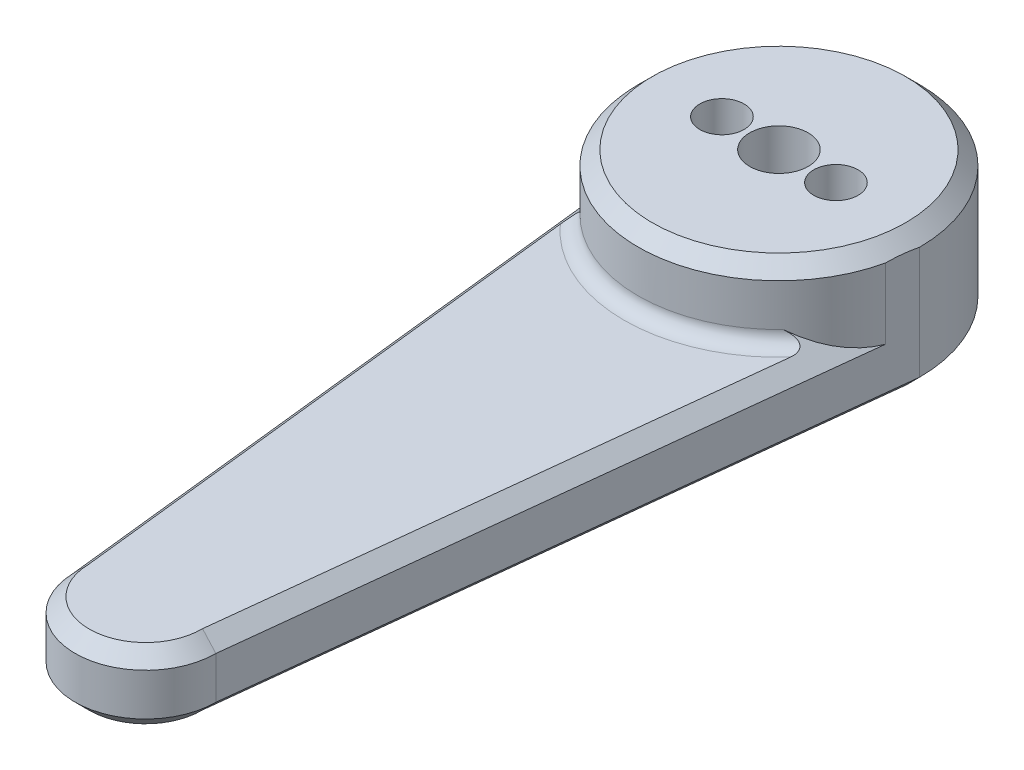
ISO-10303-21;
HEADER;
FILE_DESCRIPTION(('STEP AP214'),'2;1');
FILE_NAME('part.step','',(''),(''),'','','');
FILE_SCHEMA(('AUTOMOTIVE_DESIGN { 1 0 10303 214 1 1 1 1 }'));
ENDSEC;
DATA;
#1=APPLICATION_CONTEXT('core data for automotive mechanical design processes');
#2=APPLICATION_PROTOCOL_DEFINITION('international standard','automotive_design',2000,#1);
#3=PRODUCT_CONTEXT('',#1,'mechanical');
#4=PRODUCT('Part','Part','',(#3));
#5=PRODUCT_RELATED_PRODUCT_CATEGORY('part','',(#4));
#6=PRODUCT_DEFINITION_FORMATION('','',#4);
#7=PRODUCT_DEFINITION_CONTEXT('part definition',#1,'design');
#8=PRODUCT_DEFINITION('design','',#6,#7);
#9=PRODUCT_DEFINITION_SHAPE('','',#8);
#10=(LENGTH_UNIT() NAMED_UNIT(*) SI_UNIT(.MILLI.,.METRE.));
#11=(NAMED_UNIT(*) PLANE_ANGLE_UNIT() SI_UNIT($,.RADIAN.));
#12=(NAMED_UNIT(*) SI_UNIT($,.STERADIAN.) SOLID_ANGLE_UNIT());
#13=UNCERTAINTY_MEASURE_WITH_UNIT(LENGTH_MEASURE(1.E-05),#10,'distance_accuracy_value','');
#14=(GEOMETRIC_REPRESENTATION_CONTEXT(3) GLOBAL_UNCERTAINTY_ASSIGNED_CONTEXT((#13)) GLOBAL_UNIT_ASSIGNED_CONTEXT((#10,
#11,#12)) REPRESENTATION_CONTEXT('',''));
#15=CARTESIAN_POINT('',(0.,0.,0.));
#16=DIRECTION('',(0.,0.,1.));
#17=DIRECTION('',(1.,0.,0.));
#18=AXIS2_PLACEMENT_3D('',#15,#16,#17);
#19=CARTESIAN_POINT('',(0.,20.,90.));
#20=DIRECTION('',(0.,-1.,0.));
#21=DIRECTION('',(0.,0.,-1.));
#22=AXIS2_PLACEMENT_3D('',#19,#20,#21);
#23=CYLINDRICAL_SURFACE('',#22,10.);
#24=DIRECTION('',(0.,-1.,0.));
#25=VECTOR('',#24,1.);
#26=CARTESIAN_POINT('',(10.,20.,90.));
#27=LINE('',#26,#25);
#28=CARTESIAN_POINT('',(10.,7.99999999999998,90.));
#29=VERTEX_POINT('',#28);
#30=CARTESIAN_POINT('',(10.,2.,90.));
#31=VERTEX_POINT('',#30);
#32=EDGE_CURVE('E141',#29,#31,#27,.T.);
#33=ORIENTED_EDGE('',*,*,#32,.F.);
#34=CARTESIAN_POINT('',(0.,7.99999999999998,90.));
#35=DIRECTION('',(0.,1.,0.));
#36=DIRECTION('',(0.,0.,1.));
#37=AXIS2_PLACEMENT_3D('',#34,#35,#36);
#38=CIRCLE('',#37,10.);
#39=CARTESIAN_POINT('',(-9.99449500207726,7.99999999999998,90.3317674689486));
#40=VERTEX_POINT('',#39);
#41=EDGE_CURVE('E144',#29,#40,#38,.F.);
#42=ORIENTED_EDGE('',*,*,#41,.T.);
#43=DIRECTION('',(0.,-1.,0.));
#44=VECTOR('',#43,1.);
#45=CARTESIAN_POINT('',(-9.99449500207726,20.,90.3317674689486));
#46=LINE('',#45,#44);
#47=CARTESIAN_POINT('',(-9.99449500207726,2.,90.3317674689486));
#48=VERTEX_POINT('',#47);
#49=EDGE_CURVE('E306',#40,#48,#46,.T.);
#50=ORIENTED_EDGE('',*,*,#49,.T.);
#51=CARTESIAN_POINT('',(0.,2.,90.));
#52=DIRECTION('',(0.,1.,0.));
#53=DIRECTION('',(0.,0.,1.));
#54=AXIS2_PLACEMENT_3D('',#51,#52,#53);
#55=CIRCLE('',#54,10.);
#56=EDGE_CURVE('E254',#48,#31,#55,.T.);
#57=ORIENTED_EDGE('',*,*,#56,.T.);
#58=EDGE_LOOP('',(#33,#42,#50,#57));
#59=FACE_BOUND('',#58,.T.);
#60=ADVANCED_FACE('F32',(#59),#23,.T.);
#61=CARTESIAN_POINT('',(0.,20.,90.));
#62=DIRECTION('',(0.,1.,0.));
#63=DIRECTION('',(0.,0.,1.));
#64=AXIS2_PLACEMENT_3D('',#61,#62,#63);
#65=PLANE('',#64);
#66=CARTESIAN_POINT('',(8.1,20.,0.));
#67=DIRECTION('',(0.,1.,0.));
#68=DIRECTION('',(0.,0.,1.));
#69=AXIS2_PLACEMENT_3D('',#66,#67,#68);
#70=CIRCLE('',#69,3.15);
#71=CARTESIAN_POINT('',(8.1,20.,3.15));
#72=VERTEX_POINT('',#71);
#73=EDGE_CURVE('E321',#72,#72,#70,.T.);
#74=ORIENTED_EDGE('',*,*,#73,.F.);
#75=EDGE_LOOP('',(#74));
#76=FACE_BOUND('',#75,.T.);
#77=CARTESIAN_POINT('',(-8.1,20.,0.));
#78=DIRECTION('',(0.,1.,0.));
#79=DIRECTION('',(0.,0.,1.));
#80=AXIS2_PLACEMENT_3D('',#77,#78,#79);
#81=CIRCLE('',#80,3.15);
#82=CARTESIAN_POINT('',(-8.1,20.,3.15));
#83=VERTEX_POINT('',#82);
#84=EDGE_CURVE('E315',#83,#83,#81,.T.);
#85=ORIENTED_EDGE('',*,*,#84,.F.);
#86=EDGE_LOOP('',(#85));
#87=FACE_BOUND('',#86,.T.);
#88=CARTESIAN_POINT('',(0.,20.,0.));
#89=DIRECTION('',(0.,1.,0.));
#90=DIRECTION('',(0.,0.,1.));
#91=AXIS2_PLACEMENT_3D('',#88,#89,#90);
#92=CIRCLE('',#91,18.);
#93=CARTESIAN_POINT('',(18.,20.,0.));
#94=VERTEX_POINT('',#93);
#95=EDGE_CURVE('E287',#94,#94,#92,.T.);
#96=ORIENTED_EDGE('',*,*,#95,.T.);
#97=EDGE_LOOP('',(#96));
#98=FACE_BOUND('',#97,.T.);
#99=CARTESIAN_POINT('',(0.,20.,0.));
#100=DIRECTION('',(0.,1.,0.));
#101=DIRECTION('',(0.,0.,1.));
#102=AXIS2_PLACEMENT_3D('',#99,#100,#101);
#103=CIRCLE('',#102,4.15);
#104=CARTESIAN_POINT('',(0.,20.,4.15));
#105=VERTEX_POINT('',#104);
#106=EDGE_CURVE('E309',#105,#105,#103,.T.);
#107=ORIENTED_EDGE('',*,*,#106,.F.);
#108=EDGE_LOOP('',(#107));
#109=FACE_BOUND('',#108,.T.);
#110=ADVANCED_FACE('F211',(#76,#87,#98,#109),#65,.T.);
#111=CARTESIAN_POINT('',(10.,20.,90.));
#112=DIRECTION('',(-0.993883734673619,0.,-0.110431526074846));
#113=DIRECTION('',(-0.110431526074846,0.,0.993883734673619));
#114=AXIS2_PLACEMENT_3D('',#111,#112,#113);
#115=PLANE('',#114);
#116=DIRECTION('',(0.,-1.,0.));
#117=VECTOR('',#116,1.);
#118=CARTESIAN_POINT('',(20.,20.,0.));
#119=LINE('',#118,#117);
#120=CARTESIAN_POINT('',(20.,18.,0.));
#121=VERTEX_POINT('',#120);
#122=CARTESIAN_POINT('',(20.,2.,0.));
#123=VERTEX_POINT('',#122);
#124=EDGE_CURVE('E302',#121,#123,#119,.T.);
#125=ORIENTED_EDGE('',*,*,#124,.F.);
#126=CARTESIAN_POINT('',(20.,18.,0.));
#127=CARTESIAN_POINT('',(19.972743830948,18.0272707543448,0.245305521468181));
#128=CARTESIAN_POINT('',(19.9454325351437,18.0500547621588,0.491107183706826));
#129=CARTESIAN_POINT('',(19.8907350930835,18.0864986226516,0.983384162248454));
#130=CARTESIAN_POINT('',(19.8633489446747,18.1001582100592,1.22985949792776));
#131=CARTESIAN_POINT('',(19.8086864696529,18.1181523501618,1.72182177312356));
#132=CARTESIAN_POINT('',(19.7814103465015,18.1225367568582,1.96730688148628));
#133=CARTESIAN_POINT('',(19.7268614595144,18.1220979818596,2.45824686437043));
#134=CARTESIAN_POINT('',(19.6995886956157,18.1172750126685,2.7037017394589));
#135=CARTESIAN_POINT('',(19.6178328996438,18.0890285542843,3.43950390320581));
#136=CARTESIAN_POINT('',(19.563397789406,18.0518322923612,3.92941989534558));
#137=CARTESIAN_POINT('',(19.4819427504312,17.9694036781878,4.66251524611937));
#138=CARTESIAN_POINT('',(19.4547485638713,17.9373617142465,4.9072629251585));
#139=CARTESIAN_POINT('',(19.400503061642,17.864666508667,5.39547244522203));
#140=CARTESIAN_POINT('',(19.3734517342069,17.8240139878863,5.63893439213753));
#141=CARTESIAN_POINT('',(19.3464820316045,17.7792109072005,5.88166171555985));
#142=B_SPLINE_CURVE_WITH_KNOTS('',3,(#126,#127,#128,#129,#130,#131,#132,#133,#134,#135,#136,
#137,#138,#139,#140,#141),.UNSPECIFIED.,.F.,.F.,(4,2,2,2,2,2,2,4),(0.,0.744914608479554,
1.48985087266808,2.23077283103114,2.97167768930594,4.45309217950353,5.19795934104723,
5.94276416851786),.UNSPECIFIED.);
#143=CARTESIAN_POINT('',(19.5121951219512,18.,4.39024390243905));
#144=VERTEX_POINT('',#143);
#145=EDGE_CURVE('E194',#121,#144,#142,.T.);
#146=ORIENTED_EDGE('',*,*,#145,.T.);
#147=DIRECTION('',(0.,1.,0.));
#148=VECTOR('',#147,1.);
#149=CARTESIAN_POINT('',(19.5121951219512,10.,4.39024390243905));
#150=LINE('',#149,#148);
#151=CARTESIAN_POINT('',(19.5121951219512,7.99999999999998,4.39024390243905));
#152=VERTEX_POINT('',#151);
#153=EDGE_CURVE('E149',#144,#152,#150,.F.);
#154=ORIENTED_EDGE('',*,*,#153,.T.);
#155=DIRECTION('',(-0.110431526074846,0.,0.993883734673619));
#156=VECTOR('',#155,1.);
#157=CARTESIAN_POINT('',(10.,7.99999999999998,90.));
#158=LINE('',#157,#156);
#159=EDGE_CURVE('E202',#152,#29,#158,.T.);
#160=ORIENTED_EDGE('',*,*,#159,.T.);
#161=ORIENTED_EDGE('',*,*,#32,.T.);
#162=DIRECTION('',(0.110431526074846,0.,-0.993883734673619));
#163=VECTOR('',#162,1.);
#164=CARTESIAN_POINT('',(10.,2.,90.));
#165=LINE('',#164,#163);
#166=EDGE_CURVE('E276',#31,#123,#165,.T.);
#167=ORIENTED_EDGE('',*,*,#166,.T.);
#168=EDGE_LOOP('',(#125,#146,#154,#160,#161,#167));
#169=FACE_BOUND('',#168,.T.);
#170=ADVANCED_FACE('F205',(#169),#115,.F.);
#171=CARTESIAN_POINT('',(0.,20.,0.));
#172=DIRECTION('',(0.,-1.,0.));
#173=DIRECTION('',(0.,0.,-1.));
#174=AXIS2_PLACEMENT_3D('',#171,#172,#173);
#175=CYLINDRICAL_SURFACE('',#174,20.);
#176=DIRECTION('',(0.,-1.,0.));
#177=VECTOR('',#176,1.);
#178=CARTESIAN_POINT('',(-20.,20.,0.));
#179=LINE('',#178,#177);
#180=CARTESIAN_POINT('',(-20.,18.,0.));
#181=VERTEX_POINT('',#180);
#182=CARTESIAN_POINT('',(-20.,2.,0.));
#183=VERTEX_POINT('',#182);
#184=EDGE_CURVE('E304',#181,#183,#179,.T.);
#185=ORIENTED_EDGE('',*,*,#184,.F.);
#186=CARTESIAN_POINT('',(0.,18.,0.));
#187=DIRECTION('',(0.,1.,0.));
#188=DIRECTION('',(0.,0.,1.));
#189=AXIS2_PLACEMENT_3D('',#186,#187,#188);
#190=CIRCLE('',#189,20.);
#191=EDGE_CURVE('E277',#181,#121,#190,.F.);
#192=ORIENTED_EDGE('',*,*,#191,.T.);
#193=ORIENTED_EDGE('',*,*,#124,.T.);
#194=CARTESIAN_POINT('',(0.,2.,0.));
#195=DIRECTION('',(0.,1.,0.));
#196=DIRECTION('',(0.,0.,1.));
#197=AXIS2_PLACEMENT_3D('',#194,#195,#196);
#198=CIRCLE('',#197,20.);
#199=EDGE_CURVE('E282',#123,#183,#198,.T.);
#200=ORIENTED_EDGE('',*,*,#199,.T.);
#201=EDGE_LOOP('',(#185,#192,#193,#200));
#202=FACE_BOUND('',#201,.T.);
#203=ADVANCED_FACE('F210',(#202),#175,.T.);
#204=CARTESIAN_POINT('',(-9.99449500207726,20.,90.3317674689486));
#205=DIRECTION('',(0.993921545716873,0.,-0.11009069424698));
#206=DIRECTION('',(-0.11009069424698,0.,-0.993921545716873));
#207=AXIS2_PLACEMENT_3D('',#204,#205,#206);
#208=PLANE('',#207);
#209=ORIENTED_EDGE('',*,*,#49,.F.);
#210=DIRECTION('',(-0.11009069424698,0.,-0.993921545716873));
#211=VECTOR('',#210,1.);
#212=CARTESIAN_POINT('',(-19.5152015616087,7.99999999999999,4.37686051980004));
#213=LINE('',#212,#211);
#214=CARTESIAN_POINT('',(-19.5152015616087,7.99999999999999,4.37686051980001));
#215=VERTEX_POINT('',#214);
#216=EDGE_CURVE('E289',#40,#215,#213,.T.);
#217=ORIENTED_EDGE('',*,*,#216,.T.);
#218=DIRECTION('',(0.,1.,0.));
#219=VECTOR('',#218,1.);
#220=CARTESIAN_POINT('',(-19.5152015616087,10.,4.37686051980001));
#221=LINE('',#220,#219);
#222=CARTESIAN_POINT('',(-19.5152015616087,18.,4.37686051980001));
#223=VERTEX_POINT('',#222);
#224=EDGE_CURVE('E145',#215,#223,#221,.T.);
#225=ORIENTED_EDGE('',*,*,#224,.T.);
#226=CARTESIAN_POINT('',(-19.5152015616087,18.,4.37686051980004));
#227=CARTESIAN_POINT('',(-19.5423745915764,18.0271876255426,4.131536788017));
#228=CARTESIAN_POINT('',(-19.5696024192845,18.0498874850755,3.88571833090528));
#229=CARTESIAN_POINT('',(-19.6241323512415,18.0861617993781,3.39341083271686));
#230=CARTESIAN_POINT('',(-19.651434457606,18.0997359914394,3.14692177254003));
#231=CARTESIAN_POINT('',(-19.7059288678793,18.1175593738214,2.65493497145539));
#232=CARTESIAN_POINT('',(-19.7331209708965,18.1218584088129,2.40943904423788));
#233=CARTESIAN_POINT('',(-19.7875014804782,18.1212492696555,1.91848056214273));
#234=CARTESIAN_POINT('',(-19.8146898871133,18.1163413073683,1.67301800662716));
#235=CARTESIAN_POINT('',(-19.8961922343479,18.0878417179724,0.937197967549023));
#236=CARTESIAN_POINT('',(-19.9504578820486,18.0504791366219,0.447276482260248));
#237=CARTESIAN_POINT('',(-20.0316584304149,17.9678086956254,-0.285818854247293));
#238=CARTESIAN_POINT('',(-20.0587674835647,17.9356872150343,-0.530564990093741));
#239=CARTESIAN_POINT('',(-20.1128429005002,17.862836235457,-1.01876903270955));
#240=CARTESIAN_POINT('',(-20.139809276063,17.8221074586866,-1.26222704580621));
#241=CARTESIAN_POINT('',(-20.1666941704909,17.7772299979925,-1.50494943037283));
#242=B_SPLINE_CURVE_WITH_KNOTS('',3,(#226,#227,#228,#229,#230,#231,#232,#233,#234,#235,#236,
#237,#238,#239,#240,#241),.UNSPECIFIED.,.F.,.F.,(4,2,2,2,2,2,2,4),(0.,0.74491384396307,
1.48984913146269,2.23077106247926,2.97167594438273,4.45308910309007,5.19795468775399,
5.94275779748251),.UNSPECIFIED.);
#243=EDGE_CURVE('E186',#223,#181,#242,.T.);
#244=ORIENTED_EDGE('',*,*,#243,.T.);
#245=ORIENTED_EDGE('',*,*,#184,.T.);
#246=DIRECTION('',(0.11009069424698,0.,0.993921545716873));
#247=VECTOR('',#246,1.);
#248=CARTESIAN_POINT('',(-9.99449500207726,2.,90.3317674689486));
#249=LINE('',#248,#247);
#250=EDGE_CURVE('E294',#183,#48,#249,.T.);
#251=ORIENTED_EDGE('',*,*,#250,.T.);
#252=EDGE_LOOP('',(#209,#217,#225,#244,#245,#251));
#253=FACE_BOUND('',#252,.T.);
#254=ADVANCED_FACE('F381',(#253),#208,.F.);
#255=CARTESIAN_POINT('',(0.,0.,90.));
#256=DIRECTION('',(0.,1.,0.));
#257=DIRECTION('',(0.,0.,1.));
#258=AXIS2_PLACEMENT_3D('',#255,#256,#257);
#259=PLANE('',#258);
#260=DIRECTION('',(-0.11009069424698,0.,-0.993921545716873));
#261=VECTOR('',#260,1.);
#262=CARTESIAN_POINT('',(-7.92182151982046,0.,90.8774523850257));
#263=LINE('',#262,#261);
#264=CARTESIAN_POINT('',(-7.9976820064967,0.,90.1925682293592));
#265=VERTEX_POINT('',#264);
#266=CARTESIAN_POINT('',(-17.9996788305867,0.,-0.107526721014376));
#267=VERTEX_POINT('',#266);
#268=EDGE_CURVE('E259',#265,#267,#263,.T.);
#269=ORIENTED_EDGE('',*,*,#268,.T.);
#270=CARTESIAN_POINT('',(0.,0.,0.));
#271=DIRECTION('',(0.,1.,0.));
#272=DIRECTION('',(0.,0.,1.));
#273=AXIS2_PLACEMENT_3D('',#270,#271,#272);
#274=CIRCLE('',#273,18.);
#275=CARTESIAN_POINT('',(17.9996768262904,0.,-0.107861712888749));
#276=VERTEX_POINT('',#275);
#277=EDGE_CURVE('E269',#267,#276,#274,.F.);
#278=ORIENTED_EDGE('',*,*,#277,.T.);
#279=DIRECTION('',(-0.110431526074846,0.,0.993883734673619));
#280=VECTOR('',#279,1.);
#281=CARTESIAN_POINT('',(7.89028131114055,0.,90.8766979234601));
#282=LINE('',#281,#280);
#283=CARTESIAN_POINT('',(7.99931596562648,0.,89.8953860330868));
#284=VERTEX_POINT('',#283);
#285=EDGE_CURVE('E264',#276,#284,#282,.T.);
#286=ORIENTED_EDGE('',*,*,#285,.T.);
#287=CARTESIAN_POINT('',(0.,0.,90.));
#288=DIRECTION('',(0.,1.,0.));
#289=DIRECTION('',(0.,0.,1.));
#290=AXIS2_PLACEMENT_3D('',#287,#288,#289);
#291=CIRCLE('',#290,7.99999999999999);
#292=EDGE_CURVE('E253',#284,#265,#291,.F.);
#293=ORIENTED_EDGE('',*,*,#292,.T.);
#294=EDGE_LOOP('',(#269,#278,#286,#293));
#295=FACE_BOUND('',#294,.T.);
#296=CARTESIAN_POINT('',(0.,0.,0.));
#297=DIRECTION('',(0.,1.,0.));
#298=DIRECTION('',(0.,0.,1.));
#299=AXIS2_PLACEMENT_3D('',#296,#297,#298);
#300=CIRCLE('',#299,4.15);
#301=CARTESIAN_POINT('',(0.,0.,4.15));
#302=VERTEX_POINT('',#301);
#303=EDGE_CURVE('E308',#302,#302,#300,.T.);
#304=ORIENTED_EDGE('',*,*,#303,.T.);
#305=EDGE_LOOP('',(#304));
#306=FACE_BOUND('',#305,.T.);
#307=ADVANCED_FACE('F375',(#295,#306),#259,.F.);
#308=CARTESIAN_POINT('',(0.,0.,0.));
#309=DIRECTION('',(0.,1.,0.));
#310=DIRECTION('',(0.,0.,1.));
#311=AXIS2_PLACEMENT_3D('',#308,#309,#310);
#312=CYLINDRICAL_SURFACE('',#311,4.15);
#313=ORIENTED_EDGE('',*,*,#303,.F.);
#314=EDGE_LOOP('',(#313));
#315=FACE_BOUND('',#314,.T.);
#316=ORIENTED_EDGE('',*,*,#106,.T.);
#317=EDGE_LOOP('',(#316));
#318=FACE_BOUND('',#317,.T.);
#319=ADVANCED_FACE('F380',(#315,#318),#312,.F.);
#320=CARTESIAN_POINT('',(0.,10.,0.));
#321=DIRECTION('',(0.,1.,0.));
#322=DIRECTION('',(0.,0.,1.));
#323=AXIS2_PLACEMENT_3D('',#320,#321,#322);
#324=PLANE('',#323);
#325=DIRECTION('',(0.110431526074846,0.,-0.993883734673619));
#326=VECTOR('',#325,1.);
#327=CARTESIAN_POINT('',(17.524427652604,10.,4.16938085028936));
#328=LINE('',#327,#326);
#329=CARTESIAN_POINT('',(7.99931596562649,10.,89.8953860330868));
#330=VERTEX_POINT('',#329);
#331=CARTESIAN_POINT('',(16.3524413870213,10.,14.7172572405334));
#332=VERTEX_POINT('',#331);
#333=EDGE_CURVE('E127',#330,#332,#328,.T.);
#334=ORIENTED_EDGE('',*,*,#333,.T.);
#335=CARTESIAN_POINT('',(0.,10.,0.));
#336=DIRECTION('',(0.,1.,0.));
#337=DIRECTION('',(0.,0.,1.));
#338=AXIS2_PLACEMENT_3D('',#335,#336,#337);
#339=CIRCLE('',#338,22.);
#340=CARTESIAN_POINT('',(-16.3583550236713,10.,14.7106839038683));
#341=VERTEX_POINT('',#340);
#342=EDGE_CURVE('E225',#332,#341,#339,.F.);
#343=ORIENTED_EDGE('',*,*,#342,.T.);
#344=DIRECTION('',(0.11009069424698,0.,0.993921545716873));
#345=VECTOR('',#344,1.);
#346=CARTESIAN_POINT('',(-8.00665191064351,10.,90.1115860804547));
#347=LINE('',#346,#345);
#348=CARTESIAN_POINT('',(-7.99768200649672,10.,90.1925682293592));
#349=VERTEX_POINT('',#348);
#350=EDGE_CURVE('E130',#341,#349,#347,.T.);
#351=ORIENTED_EDGE('',*,*,#350,.T.);
#352=CARTESIAN_POINT('',(0.,10.,90.));
#353=DIRECTION('',(0.,1.,0.));
#354=DIRECTION('',(0.,0.,1.));
#355=AXIS2_PLACEMENT_3D('',#352,#353,#354);
#356=CIRCLE('',#355,8.);
#357=EDGE_CURVE('E123',#349,#330,#356,.T.);
#358=ORIENTED_EDGE('',*,*,#357,.T.);
#359=EDGE_LOOP('',(#334,#343,#351,#358));
#360=FACE_BOUND('',#359,.T.);
#361=ADVANCED_FACE('F125',(#360),#324,.T.);
#362=CARTESIAN_POINT('',(0.,10.,0.));
#363=DIRECTION('',(0.,1.,0.));
#364=DIRECTION('',(0.,0.,1.));
#365=AXIS2_PLACEMENT_3D('',#362,#363,#364);
#366=CYLINDRICAL_SURFACE('',#365,20.);
#367=CARTESIAN_POINT('',(0.,27.8784309143375,0.));
#368=DIRECTION('',(-0.702808664943816,0.707106781186548,0.0778458764475741));
#369=DIRECTION('',(0.702808664943816,0.707106781186548,-0.0778458764475741));
#370=AXIS2_PLACEMENT_3D('',#367,#368,#369);
#371=ELLIPSE('',#370,28.2842712474619,20.);
#372=CARTESIAN_POINT('',(-14.4431672509374,12.,13.8345552787739));
#373=VERTEX_POINT('',#372);
#374=EDGE_CURVE('E52',#215,#373,#371,.T.);
#375=ORIENTED_EDGE('',*,*,#374,.T.);
#376=CARTESIAN_POINT('',(0.,12.,0.));
#377=DIRECTION('',(0.,1.,0.));
#378=DIRECTION('',(0.,0.,1.));
#379=AXIS2_PLACEMENT_3D('',#376,#377,#378);
#380=CIRCLE('',#379,20.);
#381=CARTESIAN_POINT('',(14.4375615856132,12.,13.8404051769312));
#382=VERTEX_POINT('',#381);
#383=EDGE_CURVE('E223',#373,#382,#380,.T.);
#384=ORIENTED_EDGE('',*,*,#383,.T.);
#385=CARTESIAN_POINT('',(0.,27.8776746934725,0.));
#386=DIRECTION('',(0.702781928498729,0.707106781186545,0.0780868809443031));
#387=DIRECTION('',(-0.702781928498725,0.707106781186549,-0.0780868809443027));
#388=AXIS2_PLACEMENT_3D('',#385,#386,#387);
#389=ELLIPSE('',#388,28.284271247462,20.);
#390=EDGE_CURVE('E59',#382,#152,#389,.T.);
#391=ORIENTED_EDGE('',*,*,#390,.T.);
#392=ORIENTED_EDGE('',*,*,#153,.F.);
#393=CARTESIAN_POINT('',(0.,18.,0.));
#394=DIRECTION('',(0.,-1.,0.));
#395=DIRECTION('',(0.,0.,-1.));
#396=AXIS2_PLACEMENT_3D('',#393,#394,#395);
#397=CIRCLE('',#396,20.);
#398=EDGE_CURVE('E201',#144,#223,#397,.T.);
#399=ORIENTED_EDGE('',*,*,#398,.T.);
#400=ORIENTED_EDGE('',*,*,#224,.F.);
#401=EDGE_LOOP('',(#375,#384,#391,#392,#399,#400));
#402=FACE_BOUND('',#401,.T.);
#403=ADVANCED_FACE('F174',(#402),#366,.T.);
#404=CARTESIAN_POINT('',(17.7683300916284,10.,1.97425889906982));
#405=DIRECTION('',(0.702781928498729,0.707106781186545,0.0780868809443031));
#406=DIRECTION('',(-0.110431526074846,0.,0.993883734673619));
#407=AXIS2_PLACEMENT_3D('',#404,#405,#406);
#408=PLANE('',#407);
#409=ORIENTED_EDGE('',*,*,#390,.F.);
#410=CARTESIAN_POINT('',(14.4375615856132,12.,13.8404051769312));
#411=CARTESIAN_POINT('',(14.4877956769557,11.9558566204538,13.7880336579387));
#412=CARTESIAN_POINT('',(14.5385292338647,11.9111106304488,13.7366238186401));
#413=CARTESIAN_POINT('',(14.6411853268086,11.8201810113787,13.6361217032897));
#414=CARTESIAN_POINT('',(14.6931094372865,11.7739954456491,13.5870327944929));
#415=CARTESIAN_POINT('',(14.7991518061773,11.6792232920239,13.4908498259218));
#416=CARTESIAN_POINT('',(14.8532927971037,11.6306083079038,13.4438083122771));
#417=CARTESIAN_POINT('',(14.9629747365268,11.5315690173588,13.3535097771616));
#418=CARTESIAN_POINT('',(15.0185148496927,11.4811457832538,13.3102505633996));
#419=CARTESIAN_POINT('',(15.1471271075255,11.3636132764172,13.2170423585606));
#420=CARTESIAN_POINT('',(15.2207295019262,11.2958058514431,13.1686431573196));
#421=CARTESIAN_POINT('',(15.3331609270564,11.1910730532553,13.1051561553342));
#422=CARTESIAN_POINT('',(15.3709016811521,11.1557292166972,13.0855414207656));
#423=CARTESIAN_POINT('',(15.4470827505324,11.083925993695,13.0501176347866));
#424=CARTESIAN_POINT('',(15.4855226124621,11.0474673204294,13.0343062054654));
#425=CARTESIAN_POINT('',(15.5676131308338,10.9690111604623,13.0059422850816));
#426=CARTESIAN_POINT('',(15.6113423539083,10.9268685947006,12.9939964410921));
#427=CARTESIAN_POINT('',(15.6991384246763,10.841352023031,12.978217296342));
#428=CARTESIAN_POINT('',(15.7432048784735,10.7979793294467,12.9743756570513));
#429=CARTESIAN_POINT('',(15.8214940019717,10.7198736116206,12.9770509019726));
#430=CARTESIAN_POINT('',(15.8558515944593,10.6852267600578,12.9815731543096));
#431=CARTESIAN_POINT('',(15.9231397138567,10.6164771791263,12.9985340131543));
#432=CARTESIAN_POINT('',(15.9560721225699,10.5823737723022,13.0109618180499));
#433=CARTESIAN_POINT('',(16.0195296045344,10.5156001877222,13.0445050057952));
#434=CARTESIAN_POINT('',(16.0500332922702,10.4829436713374,13.065689149307));
#435=CARTESIAN_POINT('',(16.1070898460579,10.4206528840216,13.1162472349196));
#436=CARTESIAN_POINT('',(16.1336417665341,10.3910193369563,13.1456231323201));
#437=CARTESIAN_POINT('',(16.179379530894,10.3387527158016,13.2072776375056));
#438=CARTESIAN_POINT('',(16.1990587340296,10.3157069714753,13.2388528999554));
#439=CARTESIAN_POINT('',(16.234807785359,10.2727714502071,13.3059091191806));
#440=CARTESIAN_POINT('',(16.2508764921884,10.2528826718395,13.341391305761));
#441=CARTESIAN_POINT('',(16.289630181315,10.2034116774566,13.4405870109253));
#442=CARTESIAN_POINT('',(16.3092272871295,10.1766132263978,13.5068833540387));
#443=CARTESIAN_POINT('',(16.3408098406505,10.1301155827853,13.6436944432771));
#444=CARTESIAN_POINT('',(16.3527664015193,10.1104434528503,13.7142241085067));
#445=CARTESIAN_POINT('',(16.369896394485,10.0782947508531,13.8511730500912));
#446=CARTESIAN_POINT('',(16.3755639888966,10.0653454658776,13.9174254631035));
#447=CARTESIAN_POINT('',(16.382809457758,10.0434128982215,14.050824090545));
#448=CARTESIAN_POINT('',(16.3843835302452,10.0344333089154,14.117971077709));
#449=CARTESIAN_POINT('',(16.3840388806315,10.0124752296229,14.3199117891198));
#450=CARTESIAN_POINT('',(16.3770595971744,10.0044641777841,14.4552684999956));
#451=CARTESIAN_POINT('',(16.3632641548948,10.0009422434238,14.6113199525752));
#452=CARTESIAN_POINT('',(16.361263806624,10.0005862030239,14.632547169959));
#453=CARTESIAN_POINT('',(16.3570279112592,10.0001149221197,14.6749378583377));
#454=CARTESIAN_POINT('',(16.3547928435759,9.99999920044414,14.6961013718281));
#455=CARTESIAN_POINT('',(16.3524413870213,9.99999999999998,14.7172572405334));
#456=B_SPLINE_CURVE_WITH_KNOTS('',3,(#410,#411,#412,#413,#414,#415,#416,#417,#418,#419,#420,
#421,#422,#423,#424,#425,#426,#427,#428,#429,#430,#431,#432,#433,#434,#435,#436,#437,#438,#439,
#440,#441,#442,#443,#444,#445,#446,#447,#448,#449,#450,#451,#452,#453,#454,#455),.UNSPECIFIED.,
.F.,.F.,(4,2,2,2,2,2,2,2,2,2,2,2,2,2,2,2,2,2,2,2,2,2,4),(0.,0.254834278597313,0.510027592345137,
0.769864052241548,1.02954889364614,1.36240853827478,1.52820321220098,1.69389395659988,
1.87918202119939,2.06427934713432,2.2107440435556,2.35700904911163,2.504445129598,
2.65191643194807,2.78271979548295,2.913564451099,3.13471542216753,3.35669763435465,
3.5596248687329,3.76274050974095,4.16877888553289,4.23275429794379,4.29660149342232),.UNSPECIFIED.);
#457=EDGE_CURVE('E11',#382,#332,#456,.T.);
#458=ORIENTED_EDGE('',*,*,#457,.T.);
#459=ORIENTED_EDGE('',*,*,#333,.F.);
#460=CARTESIAN_POINT('',(7.99931596562649,10.,89.8953860330868));
#461=CARTESIAN_POINT('',(8.33285183395143,9.66669841377077,89.9117374486201));
#462=CARTESIAN_POINT('',(8.66634346230953,9.33338092932452,89.9286309883331));
#463=CARTESIAN_POINT('',(9.33323814040786,8.66671426264844,89.9635023109584));
#464=CARTESIAN_POINT('',(9.66664119017426,8.33336508042802,89.9814800935498));
#465=CARTESIAN_POINT('',(10.,7.99999999999998,90.));
#466=B_SPLINE_CURVE_WITH_KNOTS('',3,(#460,#461,#462,#463,#464,#465),.UNSPECIFIED.,.F.,.F.,(4,2,
4),(0.,1.41542341006464,2.8308464012327),.UNSPECIFIED.);
#467=EDGE_CURVE('E138',#29,#330,#466,.F.);
#468=ORIENTED_EDGE('',*,*,#467,.F.);
#469=ORIENTED_EDGE('',*,*,#159,.F.);
#470=EDGE_LOOP('',(#409,#458,#459,#468,#469));
#471=FACE_BOUND('',#470,.T.);
#472=ADVANCED_FACE('F137',(#471),#408,.T.);
#473=CARTESIAN_POINT('',(0.,10.,90.));
#474=DIRECTION('',(0.,-1.,0.));
#475=DIRECTION('',(0.,0.,-1.));
#476=AXIS2_PLACEMENT_3D('',#473,#474,#475);
#477=CONICAL_SURFACE('',#476,8.,0.785398163397445);
#478=ORIENTED_EDGE('',*,*,#467,.T.);
#479=ORIENTED_EDGE('',*,*,#357,.F.);
#480=CARTESIAN_POINT('',(-7.99768200649672,10.,90.1925682293592));
#481=CARTESIAN_POINT('',(-8.33055219169638,9.666682058435,90.215014200703));
#482=CARTESIAN_POINT('',(-8.66338837918618,9.33335640903888,90.2378371238659));
#483=CARTESIAN_POINT('',(-9.32899271103661,8.66668974236999,90.2842368705039));
#484=CARTESIAN_POINT('',(-9.66176085540698,8.33334872509945,90.3078136938708));
#485=CARTESIAN_POINT('',(-9.99449500207725,7.99999999999999,90.3317674689487));
#486=B_SPLINE_CURVE_WITH_KNOTS('',3,(#480,#481,#482,#483,#484,#485),.UNSPECIFIED.,.F.,.F.,(4,2,
4),(0.,1.41480076994187,2.82960133706245),.UNSPECIFIED.);
#487=EDGE_CURVE('E146',#40,#349,#486,.F.);
#488=ORIENTED_EDGE('',*,*,#487,.F.);
#489=ORIENTED_EDGE('',*,*,#41,.F.);
#490=EDGE_LOOP('',(#478,#479,#488,#489));
#491=FACE_BOUND('',#490,.T.);
#492=ADVANCED_FACE('F143',(#491),#477,.T.);
#493=CARTESIAN_POINT('',(-17.7697576893706,10.,1.96824887140607));
#494=DIRECTION('',(-0.702808664943816,0.707106781186548,0.0778458764475741));
#495=DIRECTION('',(-0.11009069424698,0.,-0.993921545716873));
#496=AXIS2_PLACEMENT_3D('',#493,#494,#495);
#497=PLANE('',#496);
#498=ORIENTED_EDGE('',*,*,#374,.F.);
#499=ORIENTED_EDGE('',*,*,#216,.F.);
#500=ORIENTED_EDGE('',*,*,#487,.T.);
#501=ORIENTED_EDGE('',*,*,#350,.F.);
#502=CARTESIAN_POINT('',(-16.3583550236713,10.,14.7106839038683));
#503=CARTESIAN_POINT('',(-16.3674892647891,10.0000419972974,14.6278366077319));
#504=CARTESIAN_POINT('',(-16.374951567182,10.001775297991,14.5447211011471));
#505=CARTESIAN_POINT('',(-16.3857546737714,10.0094182612441,14.3777641773244));
#506=CARTESIAN_POINT('',(-16.3890623417266,10.0153609172032,14.2939222280208));
#507=CARTESIAN_POINT('',(-16.3906259557589,10.0324436954734,14.1246355496729));
#508=CARTESIAN_POINT('',(-16.3887582312047,10.0437056280038,14.0392008912866));
#509=CARTESIAN_POINT('',(-16.3782901734552,10.0727322170915,13.8700479844396));
#510=CARTESIAN_POINT('',(-16.3697140837473,10.0904733355615,13.7863246670933));
#511=CARTESIAN_POINT('',(-16.3483206882616,10.1266159621607,13.6511700112741));
#512=CARTESIAN_POINT('',(-16.338043092049,10.1426070284136,13.5987047054774));
#513=CARTESIAN_POINT('',(-16.313039420258,10.178721152095,13.496403274431));
#514=CARTESIAN_POINT('',(-16.2983244380751,10.1988338657477,13.4465609525727));
#515=CARTESIAN_POINT('',(-16.2633834780019,10.2441604379363,13.3502948765312));
#516=CARTESIAN_POINT('',(-16.2430850773066,10.2694401256977,13.3039270159088));
#517=CARTESIAN_POINT('',(-16.1964397708675,10.3252747195548,13.217881425539));
#518=CARTESIAN_POINT('',(-16.1701074336957,10.3558168763775,13.1781879747117));
#519=CARTESIAN_POINT('',(-16.1179868014477,10.4144850081979,13.1158365425609));
#520=CARTESIAN_POINT('',(-16.0933367132486,10.4416808523355,13.0913513633993));
#521=CARTESIAN_POINT('',(-16.0410524685478,10.4983051953703,13.0490416499676));
#522=CARTESIAN_POINT('',(-16.0134183135399,10.5277336931499,13.031217112363));
#523=CARTESIAN_POINT('',(-15.9562022656155,10.5877596002297,13.0025349034927));
#524=CARTESIAN_POINT('',(-15.9266285109046,10.6183519244503,12.9916499487389));
#525=CARTESIAN_POINT('',(-15.8663377018169,10.679972613117,12.9762412485091));
#526=CARTESIAN_POINT('',(-15.8356199723393,10.7110012280903,12.9717213223398));
#527=CARTESIAN_POINT('',(-15.754077747235,10.7925620976022,12.9670497640525));
#528=CARTESIAN_POINT('',(-15.7028767540601,10.8429622361379,12.9714972947571));
#529=CARTESIAN_POINT('',(-15.6009249274706,10.9421372859749,12.9910908421525));
#530=CARTESIAN_POINT('',(-15.5501763486676,10.9909057650653,13.0062749302154));
#531=CARTESIAN_POINT('',(-15.450189980173,11.0861149212004,13.0441477932956));
#532=CARTESIAN_POINT('',(-15.4009436288294,11.1325704960582,13.0667785415854));
#533=CARTESIAN_POINT('',(-15.3036312359275,11.2236979697281,13.1175858358701));
#534=CARTESIAN_POINT('',(-15.2555665371358,11.268367872478,13.1457683901615));
#535=CARTESIAN_POINT('',(-15.1604588170572,11.356221337847,13.2064106345105));
#536=CARTESIAN_POINT('',(-15.1134198444303,11.3993993048718,13.2388845995619));
#537=CARTESIAN_POINT('',(-15.0204280734008,11.4843145694803,13.3071125296646));
#538=CARTESIAN_POINT('',(-14.974475528701,11.5260515315878,13.342867251507));
#539=CARTESIAN_POINT('',(-14.8867325668405,11.6053838693137,13.4144199163897));
#540=CARTESIAN_POINT('',(-14.8448751440321,11.6430652613717,13.4500414768341));
#541=CARTESIAN_POINT('',(-14.761942021524,11.717441731518,13.5231861438124));
#542=CARTESIAN_POINT('',(-14.7208664398122,11.7541366610781,13.5607095342712));
#543=CARTESIAN_POINT('',(-14.639975540932,11.8261521966591,13.6368619441162));
#544=CARTESIAN_POINT('',(-14.6001507490308,11.8614845414049,13.6754698755827));
#545=CARTESIAN_POINT('',(-14.5211725531107,11.9313326695166,13.7540414797883));
#546=CARTESIAN_POINT('',(-14.4820188722683,11.9658487919072,13.7940045722447));
#547=CARTESIAN_POINT('',(-14.4431672509374,12.,13.8345552787738));
#548=B_SPLINE_CURVE_WITH_KNOTS('',3,(#502,#503,#504,#505,#506,#507,#508,#509,#510,#511,#512,
#513,#514,#515,#516,#517,#518,#519,#520,#521,#522,#523,#524,#525,#526,#527,#528,#529,#530,#531,
#532,#533,#534,#535,#536,#537,#538,#539,#540,#541,#542,#543,#544,#545,#546,#547),.UNSPECIFIED.,
.F.,.F.,(4,2,2,2,2,2,2,2,2,2,2,2,2,2,2,2,2,2,2,2,2,2,4),(0.,0.250141546757716,0.502265742187498,
0.760466276233622,1.01773798148666,1.1848462781279,1.35154022213129,1.52050756291326,
1.68907116252478,1.82080492177774,1.95253861508347,2.08375114060746,2.21504236611795,
2.42973921801704,2.64520121852139,2.85902253054081,3.0730765290687,3.28786137769966,
3.50269589715135,3.70257054086459,3.90247511234309,4.09974518471824,4.29693182659652),.UNSPECIFIED.);
#549=EDGE_CURVE('E45',#341,#373,#548,.T.);
#550=ORIENTED_EDGE('',*,*,#549,.T.);
#551=EDGE_LOOP('',(#498,#499,#500,#501,#550));
#552=FACE_BOUND('',#551,.T.);
#553=ADVANCED_FACE('F180',(#552),#497,.T.);
#554=CARTESIAN_POINT('',(0.,20.,0.));
#555=DIRECTION('',(0.,-1.,0.));
#556=DIRECTION('',(0.,0.,-1.));
#557=AXIS2_PLACEMENT_3D('',#554,#555,#556);
#558=CONICAL_SURFACE('',#557,18.,0.785398163397448);
#559=ORIENTED_EDGE('',*,*,#145,.F.);
#560=ORIENTED_EDGE('',*,*,#191,.F.);
#561=ORIENTED_EDGE('',*,*,#243,.F.);
#562=ORIENTED_EDGE('',*,*,#398,.F.);
#563=EDGE_LOOP('',(#559,#560,#561,#562));
#564=FACE_BOUND('',#563,.T.);
#565=ORIENTED_EDGE('',*,*,#95,.F.);
#566=EDGE_LOOP('',(#565));
#567=FACE_BOUND('',#566,.T.);
#568=ADVANCED_FACE('F175',(#564,#567),#558,.T.);
#569=CARTESIAN_POINT('',(0.,2.,90.));
#570=DIRECTION('',(0.,1.,0.));
#571=DIRECTION('',(0.,0.,1.));
#572=AXIS2_PLACEMENT_3D('',#569,#570,#571);
#573=CONICAL_SURFACE('',#572,10.,0.785398163397452);
#574=CARTESIAN_POINT('',(-7.9976820064967,0.,90.1925682293592));
#575=CARTESIAN_POINT('',(-8.33055219169636,0.333317941565001,90.215014200703));
#576=CARTESIAN_POINT('',(-8.66338837918617,0.666643590961121,90.2378371238659));
#577=CARTESIAN_POINT('',(-9.32899271103661,1.33331025763,90.2842368705038));
#578=CARTESIAN_POINT('',(-9.66176085540699,1.66665127490055,90.3078136938707));
#579=CARTESIAN_POINT('',(-9.99449500207725,2.,90.3317674689486));
#580=B_SPLINE_CURVE_WITH_KNOTS('',3,(#574,#575,#576,#577,#578,#579),.UNSPECIFIED.,.F.,.F.,(4,2,
4),(0.,1.41480076994188,2.82960133706245),.UNSPECIFIED.);
#581=EDGE_CURVE('E233',#265,#48,#580,.T.);
#582=ORIENTED_EDGE('',*,*,#581,.F.);
#583=ORIENTED_EDGE('',*,*,#292,.F.);
#584=CARTESIAN_POINT('',(7.99931596562648,0.,89.8953860330868));
#585=CARTESIAN_POINT('',(8.33285183395142,0.333301586229224,89.9117374486201));
#586=CARTESIAN_POINT('',(8.66634346230953,0.666619070675477,89.9286309883331));
#587=CARTESIAN_POINT('',(9.33323814040785,1.33328573735155,89.9635023109584));
#588=CARTESIAN_POINT('',(9.66664119017426,1.66663491957197,89.9814800935498));
#589=CARTESIAN_POINT('',(10.,2.,90.));
#590=B_SPLINE_CURVE_WITH_KNOTS('',3,(#584,#585,#586,#587,#588,#589),.UNSPECIFIED.,.F.,.F.,(4,2,
4),(0.,1.41542341006464,2.8308464012327),.UNSPECIFIED.);
#591=EDGE_CURVE('E151',#31,#284,#590,.F.);
#592=ORIENTED_EDGE('',*,*,#591,.F.);
#593=ORIENTED_EDGE('',*,*,#56,.F.);
#594=EDGE_LOOP('',(#582,#583,#592,#593));
#595=FACE_BOUND('',#594,.T.);
#596=ADVANCED_FACE('F179',(#595),#573,.T.);
#597=CARTESIAN_POINT('',(10.,2.,90.));
#598=DIRECTION('',(-0.702781928498724,0.707106781186551,-0.0780868809443026));
#599=DIRECTION('',(0.110431526074846,0.,-0.993883734673619));
#600=AXIS2_PLACEMENT_3D('',#597,#598,#599);
#601=PLANE('',#600);
#602=ORIENTED_EDGE('',*,*,#591,.T.);
#603=ORIENTED_EDGE('',*,*,#285,.F.);
#604=CARTESIAN_POINT('',(17.9996768262903,0.,-0.107861712888761));
#605=CARTESIAN_POINT('',(18.3331050956566,0.333319133703919,-0.0903830075854075));
#606=CARTESIAN_POINT('',(18.6665128306141,0.666645369687787,-0.0726551787231199));
#607=CARTESIAN_POINT('',(19.3332872218495,1.33331203635486,-0.0367012744124659));
#608=CARTESIAN_POINT('',(19.6666538781285,1.66665246703766,-0.0184751989788384));
#609=CARTESIAN_POINT('',(20.0000000000001,1.99999999999997,-1.01632094423433E-12));
#610=B_SPLINE_CURVE_WITH_KNOTS('',3,(#604,#605,#606,#607,#608,#609),.UNSPECIFIED.,.F.,.F.,(4,2,
4),(0.,1.41535591254201,2.83071178321543),.UNSPECIFIED.);
#611=EDGE_CURVE('E257',#123,#276,#610,.F.);
#612=ORIENTED_EDGE('',*,*,#611,.F.);
#613=ORIENTED_EDGE('',*,*,#166,.F.);
#614=EDGE_LOOP('',(#602,#603,#612,#613));
#615=FACE_BOUND('',#614,.T.);
#616=ADVANCED_FACE('F237',(#615),#601,.F.);
#617=CARTESIAN_POINT('',(-9.99449500207726,2.,90.3317674689486));
#618=DIRECTION('',(0.702808664943813,0.707106781186551,-0.0778458764475737));
#619=DIRECTION('',(0.11009069424698,0.,0.993921545716873));
#620=AXIS2_PLACEMENT_3D('',#617,#618,#619);
#621=PLANE('',#620);
#622=ORIENTED_EDGE('',*,*,#581,.T.);
#623=ORIENTED_EDGE('',*,*,#250,.F.);
#624=CARTESIAN_POINT('',(-20.,2.,0.));
#625=CARTESIAN_POINT('',(-19.6666539575689,1.66665255524342,-0.0184178237651891));
#626=CARTESIAN_POINT('',(-19.3332875080193,1.33331216864816,-0.036587295604257));
#627=CARTESIAN_POINT('',(-18.6665137848828,0.666645501981058,-0.072429535956996));
#628=CARTESIAN_POINT('',(-18.3331065112945,0.333319221909635,-0.0901023044560652));
#629=CARTESIAN_POINT('',(-17.9996788305867,0.,-0.107526721014415));
#630=B_SPLINE_CURVE_WITH_KNOTS('',3,(#624,#625,#626,#627,#628,#629),.UNSPECIFIED.,.F.,.F.,(4,2,
4),(0.,1.41534878900883,2.83069761962555),.UNSPECIFIED.);
#631=EDGE_CURVE('E163',#267,#183,#630,.F.);
#632=ORIENTED_EDGE('',*,*,#631,.F.);
#633=ORIENTED_EDGE('',*,*,#268,.F.);
#634=EDGE_LOOP('',(#622,#623,#632,#633));
#635=FACE_BOUND('',#634,.T.);
#636=ADVANCED_FACE('F182',(#635),#621,.F.);
#637=CARTESIAN_POINT('',(0.,2.,0.));
#638=DIRECTION('',(0.,1.,0.));
#639=DIRECTION('',(0.,0.,1.));
#640=AXIS2_PLACEMENT_3D('',#637,#638,#639);
#641=CONICAL_SURFACE('',#640,20.,0.785398163397453);
#642=ORIENTED_EDGE('',*,*,#611,.T.);
#643=ORIENTED_EDGE('',*,*,#277,.F.);
#644=ORIENTED_EDGE('',*,*,#631,.T.);
#645=ORIENTED_EDGE('',*,*,#199,.F.);
#646=EDGE_LOOP('',(#642,#643,#644,#645));
#647=FACE_BOUND('',#646,.T.);
#648=ADVANCED_FACE('F335',(#647),#641,.T.);
#649=CARTESIAN_POINT('',(0.,12.,0.));
#650=DIRECTION('',(0.,1.,0.));
#651=DIRECTION('',(0.,0.,1.));
#652=AXIS2_PLACEMENT_3D('',#649,#650,#651);
#653=TOROIDAL_SURFACE('',#652,22.,2.);
#654=ORIENTED_EDGE('',*,*,#457,.F.);
#655=ORIENTED_EDGE('',*,*,#383,.F.);
#656=ORIENTED_EDGE('',*,*,#549,.F.);
#657=ORIENTED_EDGE('',*,*,#342,.F.);
#658=EDGE_LOOP('',(#654,#655,#656,#657));
#659=FACE_BOUND('',#658,.T.);
#660=ADVANCED_FACE('F34',(#659),#653,.F.);
#661=CARTESIAN_POINT('',(-8.1,2.,0.));
#662=DIRECTION('',(0.,1.,0.));
#663=DIRECTION('',(0.,0.,1.));
#664=AXIS2_PLACEMENT_3D('',#661,#662,#663);
#665=CYLINDRICAL_SURFACE('',#664,3.15);
#666=CARTESIAN_POINT('',(-8.1,2.,0.));
#667=DIRECTION('',(0.,1.,0.));
#668=DIRECTION('',(0.,0.,1.));
#669=AXIS2_PLACEMENT_3D('',#666,#667,#668);
#670=CIRCLE('',#669,3.15);
#671=CARTESIAN_POINT('',(-8.1,2.,3.15));
#672=VERTEX_POINT('',#671);
#673=EDGE_CURVE('E318',#672,#672,#670,.T.);
#674=ORIENTED_EDGE('',*,*,#673,.F.);
#675=EDGE_LOOP('',(#674));
#676=FACE_BOUND('',#675,.T.);
#677=ORIENTED_EDGE('',*,*,#84,.T.);
#678=EDGE_LOOP('',(#677));
#679=FACE_BOUND('',#678,.T.);
#680=ADVANCED_FACE('F343',(#676,#679),#665,.F.);
#681=CARTESIAN_POINT('',(-8.1,2.,0.));
#682=DIRECTION('',(0.,1.,0.));
#683=DIRECTION('',(0.,0.,1.));
#684=AXIS2_PLACEMENT_3D('',#681,#682,#683);
#685=PLANE('',#684);
#686=ORIENTED_EDGE('',*,*,#673,.T.);
#687=EDGE_LOOP('',(#686));
#688=FACE_BOUND('',#687,.T.);
#689=ADVANCED_FACE('F464',(#688),#685,.T.);
#690=CARTESIAN_POINT('',(8.1,2.,0.));
#691=DIRECTION('',(0.,1.,0.));
#692=DIRECTION('',(0.,0.,1.));
#693=AXIS2_PLACEMENT_3D('',#690,#691,#692);
#694=CYLINDRICAL_SURFACE('',#693,3.15);
#695=CARTESIAN_POINT('',(8.1,2.,0.));
#696=DIRECTION('',(0.,1.,0.));
#697=DIRECTION('',(0.,0.,1.));
#698=AXIS2_PLACEMENT_3D('',#695,#696,#697);
#699=CIRCLE('',#698,3.15);
#700=CARTESIAN_POINT('',(8.1,2.,3.15));
#701=VERTEX_POINT('',#700);
#702=EDGE_CURVE('E324',#701,#701,#699,.T.);
#703=ORIENTED_EDGE('',*,*,#702,.F.);
#704=EDGE_LOOP('',(#703));
#705=FACE_BOUND('',#704,.T.);
#706=ORIENTED_EDGE('',*,*,#73,.T.);
#707=EDGE_LOOP('',(#706));
#708=FACE_BOUND('',#707,.T.);
#709=ADVANCED_FACE('F474',(#705,#708),#694,.F.);
#710=CARTESIAN_POINT('',(8.1,2.,0.));
#711=DIRECTION('',(0.,1.,0.));
#712=DIRECTION('',(0.,0.,1.));
#713=AXIS2_PLACEMENT_3D('',#710,#711,#712);
#714=PLANE('',#713);
#715=ORIENTED_EDGE('',*,*,#702,.T.);
#716=EDGE_LOOP('',(#715));
#717=FACE_BOUND('',#716,.T.);
#718=ADVANCED_FACE('F484',(#717),#714,.T.);
#719=CLOSED_SHELL('',(#60,#110,#170,#203,#254,#307,#319,#361,#403,#472,#492,#553,#568,#596,#616,
#636,#648,#660,#680,#689,#709,#718));
#720=MANIFOLD_SOLID_BREP('B2',#719);
#721=ADVANCED_BREP_SHAPE_REPRESENTATION('',(#18,#720),#14);
#722=SHAPE_DEFINITION_REPRESENTATION(#9,#721);
ENDSEC;
END-ISO-10303-21;
